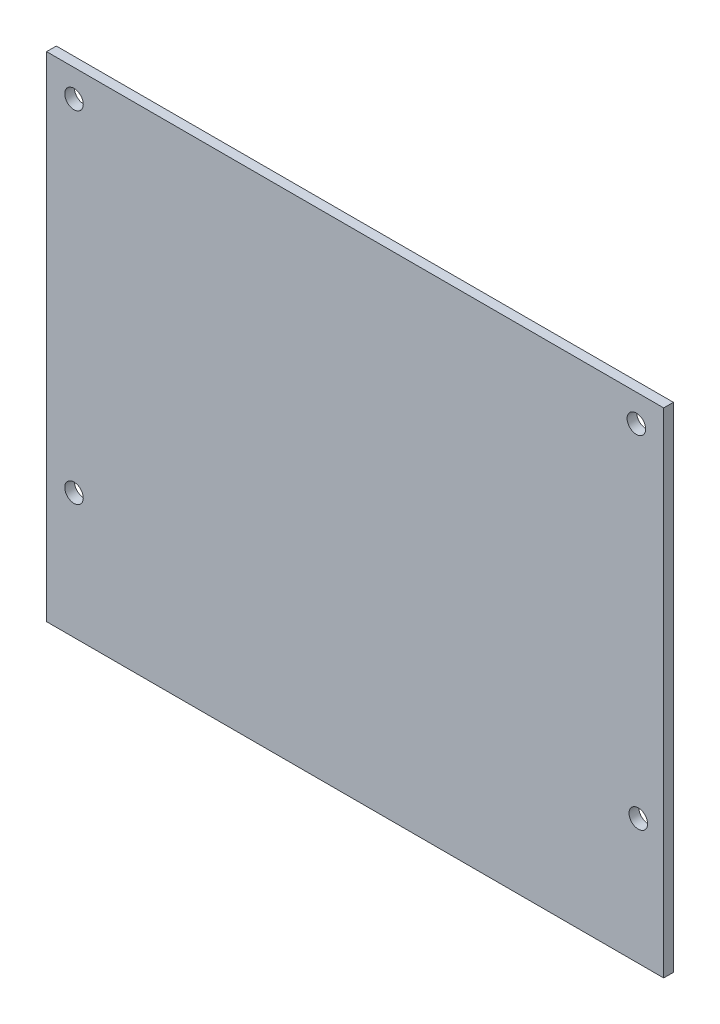
ISO-10303-21;
HEADER;
FILE_DESCRIPTION(('STEP AP214'),'2;1');
FILE_NAME('part.step','',(''),(''),'','','');
FILE_SCHEMA(('AUTOMOTIVE_DESIGN { 1 0 10303 214 1 1 1 1 }'));
ENDSEC;
DATA;
#1=APPLICATION_CONTEXT('core data for automotive mechanical design processes');
#2=APPLICATION_PROTOCOL_DEFINITION('international standard','automotive_design',2000,#1);
#3=PRODUCT_CONTEXT('',#1,'mechanical');
#4=PRODUCT('Part','Part','',(#3));
#5=PRODUCT_RELATED_PRODUCT_CATEGORY('part','',(#4));
#6=PRODUCT_DEFINITION_FORMATION('','',#4);
#7=PRODUCT_DEFINITION_CONTEXT('part definition',#1,'design');
#8=PRODUCT_DEFINITION('design','',#6,#7);
#9=PRODUCT_DEFINITION_SHAPE('','',#8);
#10=(LENGTH_UNIT() NAMED_UNIT(*) SI_UNIT(.MILLI.,.METRE.));
#11=(NAMED_UNIT(*) PLANE_ANGLE_UNIT() SI_UNIT($,.RADIAN.));
#12=(NAMED_UNIT(*) SI_UNIT($,.STERADIAN.) SOLID_ANGLE_UNIT());
#13=UNCERTAINTY_MEASURE_WITH_UNIT(LENGTH_MEASURE(1.E-05),#10,'distance_accuracy_value','');
#14=(GEOMETRIC_REPRESENTATION_CONTEXT(3) GLOBAL_UNCERTAINTY_ASSIGNED_CONTEXT((#13)) GLOBAL_UNIT_ASSIGNED_CONTEXT((#10,
#11,#12)) REPRESENTATION_CONTEXT('',''));
#15=CARTESIAN_POINT('',(0.,0.,0.));
#16=DIRECTION('',(0.,0.,1.));
#17=DIRECTION('',(1.,0.,0.));
#18=AXIS2_PLACEMENT_3D('',#15,#16,#17);
#19=CARTESIAN_POINT('',(0.,0.,-1.5748));
#20=DIRECTION('',(1.,0.,0.));
#21=DIRECTION('',(0.,0.,-1.));
#22=AXIS2_PLACEMENT_3D('',#19,#20,#21);
#23=PLANE('',#22);
#24=DIRECTION('',(0.,1.,0.));
#25=VECTOR('',#24,1.);
#26=CARTESIAN_POINT('',(0.,0.,0.));
#27=LINE('',#26,#25);
#28=CARTESIAN_POINT('',(0.,0.,0.));
#29=VERTEX_POINT('',#28);
#30=CARTESIAN_POINT('',(0.,79.9999924,0.));
#31=VERTEX_POINT('',#30);
#32=EDGE_CURVE('E96',#29,#31,#27,.T.);
#33=ORIENTED_EDGE('',*,*,#32,.T.);
#34=DIRECTION('',(0.,0.,1.));
#35=VECTOR('',#34,1.);
#36=CARTESIAN_POINT('',(0.,79.9999924,-1.5748));
#37=LINE('',#36,#35);
#38=CARTESIAN_POINT('',(0.,79.9999924,-1.5748));
#39=VERTEX_POINT('',#38);
#40=EDGE_CURVE('E11',#39,#31,#37,.T.);
#41=ORIENTED_EDGE('',*,*,#40,.F.);
#42=DIRECTION('',(0.,1.,0.));
#43=VECTOR('',#42,1.);
#44=CARTESIAN_POINT('',(0.,0.,-1.5748));
#45=LINE('',#44,#43);
#46=CARTESIAN_POINT('',(0.,0.,-1.5748));
#47=VERTEX_POINT('',#46);
#48=EDGE_CURVE('E82',#47,#39,#45,.T.);
#49=ORIENTED_EDGE('',*,*,#48,.F.);
#50=DIRECTION('',(0.,0.,1.));
#51=VECTOR('',#50,1.);
#52=CARTESIAN_POINT('',(0.,0.,-1.5748));
#53=LINE('',#52,#51);
#54=EDGE_CURVE('E49',#47,#29,#53,.T.);
#55=ORIENTED_EDGE('',*,*,#54,.T.);
#56=EDGE_LOOP('',(#33,#41,#49,#55));
#57=FACE_BOUND('',#56,.T.);
#58=ADVANCED_FACE('F33',(#57),#23,.F.);
#59=CARTESIAN_POINT('',(0.,79.9999924,-1.5748));
#60=DIRECTION('',(0.,-1.,0.));
#61=DIRECTION('',(0.,0.,-1.));
#62=AXIS2_PLACEMENT_3D('',#59,#60,#61);
#63=PLANE('',#62);
#64=DIRECTION('',(1.,0.,0.));
#65=VECTOR('',#64,1.);
#66=CARTESIAN_POINT('',(0.,79.9999924,0.));
#67=LINE('',#66,#65);
#68=CARTESIAN_POINT('',(100.0000032,79.9999924,0.));
#69=VERTEX_POINT('',#68);
#70=EDGE_CURVE('E87',#31,#69,#67,.T.);
#71=ORIENTED_EDGE('',*,*,#70,.T.);
#72=DIRECTION('',(0.,0.,1.));
#73=VECTOR('',#72,1.);
#74=CARTESIAN_POINT('',(100.0000032,79.9999924,-1.5748));
#75=LINE('',#74,#73);
#76=CARTESIAN_POINT('',(100.0000032,79.9999924,-1.5748));
#77=VERTEX_POINT('',#76);
#78=EDGE_CURVE('E41',#77,#69,#75,.T.);
#79=ORIENTED_EDGE('',*,*,#78,.F.);
#80=DIRECTION('',(1.,0.,0.));
#81=VECTOR('',#80,1.);
#82=CARTESIAN_POINT('',(0.,79.9999924,-1.5748));
#83=LINE('',#82,#81);
#84=EDGE_CURVE('E75',#39,#77,#83,.T.);
#85=ORIENTED_EDGE('',*,*,#84,.F.);
#86=ORIENTED_EDGE('',*,*,#40,.T.);
#87=EDGE_LOOP('',(#71,#79,#85,#86));
#88=FACE_BOUND('',#87,.T.);
#89=ADVANCED_FACE('F86',(#88),#63,.F.);
#90=CARTESIAN_POINT('',(100.0000032,79.9999924,-1.5748));
#91=DIRECTION('',(-1.,0.,0.));
#92=DIRECTION('',(0.,0.,1.));
#93=AXIS2_PLACEMENT_3D('',#90,#91,#92);
#94=PLANE('',#93);
#95=DIRECTION('',(0.,-1.,0.));
#96=VECTOR('',#95,1.);
#97=CARTESIAN_POINT('',(100.0000032,79.9999924,0.));
#98=LINE('',#97,#96);
#99=CARTESIAN_POINT('',(100.0000032,0.,0.));
#100=VERTEX_POINT('',#99);
#101=EDGE_CURVE('E100',#69,#100,#98,.T.);
#102=ORIENTED_EDGE('',*,*,#101,.T.);
#103=DIRECTION('',(0.,0.,1.));
#104=VECTOR('',#103,1.);
#105=CARTESIAN_POINT('',(100.0000032,0.,-1.5748));
#106=LINE('',#105,#104);
#107=CARTESIAN_POINT('',(100.0000032,0.,-1.5748));
#108=VERTEX_POINT('',#107);
#109=EDGE_CURVE('E64',#108,#100,#106,.T.);
#110=ORIENTED_EDGE('',*,*,#109,.F.);
#111=DIRECTION('',(0.,-1.,0.));
#112=VECTOR('',#111,1.);
#113=CARTESIAN_POINT('',(100.0000032,79.9999924,-1.5748));
#114=LINE('',#113,#112);
#115=EDGE_CURVE('E81',#77,#108,#114,.T.);
#116=ORIENTED_EDGE('',*,*,#115,.F.);
#117=ORIENTED_EDGE('',*,*,#78,.T.);
#118=EDGE_LOOP('',(#102,#110,#116,#117));
#119=FACE_BOUND('',#118,.T.);
#120=ADVANCED_FACE('F90',(#119),#94,.F.);
#121=CARTESIAN_POINT('',(0.,0.,-1.5748));
#122=DIRECTION('',(0.,-1.,0.));
#123=DIRECTION('',(0.,0.,-1.));
#124=AXIS2_PLACEMENT_3D('',#121,#122,#123);
#125=PLANE('',#124);
#126=DIRECTION('',(1.,0.,0.));
#127=VECTOR('',#126,1.);
#128=CARTESIAN_POINT('',(0.,0.,0.));
#129=LINE('',#128,#127);
#130=EDGE_CURVE('E102',#29,#100,#129,.T.);
#131=ORIENTED_EDGE('',*,*,#130,.F.);
#132=ORIENTED_EDGE('',*,*,#54,.F.);
#133=DIRECTION('',(1.,0.,0.));
#134=VECTOR('',#133,1.);
#135=CARTESIAN_POINT('',(0.,0.,-1.5748));
#136=LINE('',#135,#134);
#137=EDGE_CURVE('E91',#47,#108,#136,.T.);
#138=ORIENTED_EDGE('',*,*,#137,.T.);
#139=ORIENTED_EDGE('',*,*,#109,.T.);
#140=EDGE_LOOP('',(#131,#132,#138,#139));
#141=FACE_BOUND('',#140,.T.);
#142=ADVANCED_FACE('F151',(#141),#125,.T.);
#143=CARTESIAN_POINT('',(0.,79.9999924,-1.5748));
#144=DIRECTION('',(0.,0.,-1.));
#145=DIRECTION('',(-1.,0.,0.));
#146=AXIS2_PLACEMENT_3D('',#143,#144,#145);
#147=PLANE('',#146);
#148=CARTESIAN_POINT('',(4.445,20.32,-1.5748));
#149=DIRECTION('',(0.,0.,1.));
#150=DIRECTION('',(1.,0.,0.));
#151=AXIS2_PLACEMENT_3D('',#148,#149,#150);
#152=CIRCLE('',#151,1.499997);
#153=CARTESIAN_POINT('',(5.944997,20.32,-1.5748));
#154=VERTEX_POINT('',#153);
#155=EDGE_CURVE('E123',#154,#154,#152,.T.);
#156=ORIENTED_EDGE('',*,*,#155,.T.);
#157=EDGE_LOOP('',(#156));
#158=FACE_BOUND('',#157,.T.);
#159=CARTESIAN_POINT('',(4.445,75.565,-1.5748));
#160=DIRECTION('',(0.,0.,1.));
#161=DIRECTION('',(1.,0.,0.));
#162=AXIS2_PLACEMENT_3D('',#159,#160,#161);
#163=CIRCLE('',#162,1.499997);
#164=CARTESIAN_POINT('',(5.944997,75.565,-1.5748));
#165=VERTEX_POINT('',#164);
#166=EDGE_CURVE('E117',#165,#165,#163,.T.);
#167=ORIENTED_EDGE('',*,*,#166,.T.);
#168=EDGE_LOOP('',(#167));
#169=FACE_BOUND('',#168,.T.);
#170=CARTESIAN_POINT('',(95.5675,75.565,-1.5748));
#171=DIRECTION('',(0.,0.,1.));
#172=DIRECTION('',(1.,0.,0.));
#173=AXIS2_PLACEMENT_3D('',#170,#171,#172);
#174=CIRCLE('',#173,1.49999699999999);
#175=CARTESIAN_POINT('',(97.067497,75.565,-1.5748));
#176=VERTEX_POINT('',#175);
#177=EDGE_CURVE('E111',#176,#176,#174,.T.);
#178=ORIENTED_EDGE('',*,*,#177,.T.);
#179=EDGE_LOOP('',(#178));
#180=FACE_BOUND('',#179,.T.);
#181=CARTESIAN_POINT('',(95.885,20.32,-1.5748));
#182=DIRECTION('',(0.,0.,1.));
#183=DIRECTION('',(1.,0.,0.));
#184=AXIS2_PLACEMENT_3D('',#181,#182,#183);
#185=CIRCLE('',#184,1.49999700000001);
#186=CARTESIAN_POINT('',(97.384997,20.32,-1.5748));
#187=VERTEX_POINT('',#186);
#188=EDGE_CURVE('E98',#187,#187,#185,.T.);
#189=ORIENTED_EDGE('',*,*,#188,.T.);
#190=EDGE_LOOP('',(#189));
#191=FACE_BOUND('',#190,.T.);
#192=ORIENTED_EDGE('',*,*,#48,.T.);
#193=ORIENTED_EDGE('',*,*,#84,.T.);
#194=ORIENTED_EDGE('',*,*,#115,.T.);
#195=ORIENTED_EDGE('',*,*,#137,.F.);
#196=EDGE_LOOP('',(#192,#193,#194,#195));
#197=FACE_BOUND('',#196,.T.);
#198=ADVANCED_FACE('F78',(#158,#169,#180,#191,#197),#147,.T.);
#199=CARTESIAN_POINT('',(0.,79.9999924,0.));
#200=DIRECTION('',(0.,0.,-1.));
#201=DIRECTION('',(-1.,0.,0.));
#202=AXIS2_PLACEMENT_3D('',#199,#200,#201);
#203=PLANE('',#202);
#204=CARTESIAN_POINT('',(4.445,20.32,0.));
#205=DIRECTION('',(0.,0.,1.));
#206=DIRECTION('',(1.,0.,0.));
#207=AXIS2_PLACEMENT_3D('',#204,#205,#206);
#208=CIRCLE('',#207,1.499997);
#209=CARTESIAN_POINT('',(5.944997,20.32,0.));
#210=VERTEX_POINT('',#209);
#211=EDGE_CURVE('E126',#210,#210,#208,.T.);
#212=ORIENTED_EDGE('',*,*,#211,.F.);
#213=EDGE_LOOP('',(#212));
#214=FACE_BOUND('',#213,.T.);
#215=CARTESIAN_POINT('',(4.445,75.565,0.));
#216=DIRECTION('',(0.,0.,1.));
#217=DIRECTION('',(1.,0.,0.));
#218=AXIS2_PLACEMENT_3D('',#215,#216,#217);
#219=CIRCLE('',#218,1.499997);
#220=CARTESIAN_POINT('',(5.944997,75.565,0.));
#221=VERTEX_POINT('',#220);
#222=EDGE_CURVE('E120',#221,#221,#219,.T.);
#223=ORIENTED_EDGE('',*,*,#222,.F.);
#224=EDGE_LOOP('',(#223));
#225=FACE_BOUND('',#224,.T.);
#226=CARTESIAN_POINT('',(95.5675,75.565,0.));
#227=DIRECTION('',(0.,0.,1.));
#228=DIRECTION('',(1.,0.,0.));
#229=AXIS2_PLACEMENT_3D('',#226,#227,#228);
#230=CIRCLE('',#229,1.49999699999999);
#231=CARTESIAN_POINT('',(97.067497,75.565,0.));
#232=VERTEX_POINT('',#231);
#233=EDGE_CURVE('E114',#232,#232,#230,.T.);
#234=ORIENTED_EDGE('',*,*,#233,.F.);
#235=EDGE_LOOP('',(#234));
#236=FACE_BOUND('',#235,.T.);
#237=CARTESIAN_POINT('',(95.885,20.32,0.));
#238=DIRECTION('',(0.,0.,1.));
#239=DIRECTION('',(1.,0.,0.));
#240=AXIS2_PLACEMENT_3D('',#237,#238,#239);
#241=CIRCLE('',#240,1.49999700000001);
#242=CARTESIAN_POINT('',(97.384997,20.32,0.));
#243=VERTEX_POINT('',#242);
#244=EDGE_CURVE('E108',#243,#243,#241,.T.);
#245=ORIENTED_EDGE('',*,*,#244,.F.);
#246=EDGE_LOOP('',(#245));
#247=FACE_BOUND('',#246,.T.);
#248=ORIENTED_EDGE('',*,*,#32,.F.);
#249=ORIENTED_EDGE('',*,*,#130,.T.);
#250=ORIENTED_EDGE('',*,*,#101,.F.);
#251=ORIENTED_EDGE('',*,*,#70,.F.);
#252=EDGE_LOOP('',(#248,#249,#250,#251));
#253=FACE_BOUND('',#252,.T.);
#254=ADVANCED_FACE('F141',(#214,#225,#236,#247,#253),#203,.F.);
#255=CARTESIAN_POINT('',(95.885,20.32,-1.5748));
#256=DIRECTION('',(0.,0.,1.));
#257=DIRECTION('',(1.,0.,0.));
#258=AXIS2_PLACEMENT_3D('',#255,#256,#257);
#259=CYLINDRICAL_SURFACE('',#258,1.49999700000001);
#260=ORIENTED_EDGE('',*,*,#188,.F.);
#261=EDGE_LOOP('',(#260));
#262=FACE_BOUND('',#261,.T.);
#263=ORIENTED_EDGE('',*,*,#244,.T.);
#264=EDGE_LOOP('',(#263));
#265=FACE_BOUND('',#264,.T.);
#266=ADVANCED_FACE('F144',(#262,#265),#259,.F.);
#267=CARTESIAN_POINT('',(95.5675,75.565,-1.5748));
#268=DIRECTION('',(0.,0.,1.));
#269=DIRECTION('',(1.,0.,0.));
#270=AXIS2_PLACEMENT_3D('',#267,#268,#269);
#271=CYLINDRICAL_SURFACE('',#270,1.49999699999999);
#272=ORIENTED_EDGE('',*,*,#177,.F.);
#273=EDGE_LOOP('',(#272));
#274=FACE_BOUND('',#273,.T.);
#275=ORIENTED_EDGE('',*,*,#233,.T.);
#276=EDGE_LOOP('',(#275));
#277=FACE_BOUND('',#276,.T.);
#278=ADVANCED_FACE('F195',(#274,#277),#271,.F.);
#279=CARTESIAN_POINT('',(4.445,75.565,-1.5748));
#280=DIRECTION('',(0.,0.,1.));
#281=DIRECTION('',(1.,0.,0.));
#282=AXIS2_PLACEMENT_3D('',#279,#280,#281);
#283=CYLINDRICAL_SURFACE('',#282,1.499997);
#284=ORIENTED_EDGE('',*,*,#166,.F.);
#285=EDGE_LOOP('',(#284));
#286=FACE_BOUND('',#285,.T.);
#287=ORIENTED_EDGE('',*,*,#222,.T.);
#288=EDGE_LOOP('',(#287));
#289=FACE_BOUND('',#288,.T.);
#290=ADVANCED_FACE('F137',(#286,#289),#283,.F.);
#291=CARTESIAN_POINT('',(4.445,20.32,-1.5748));
#292=DIRECTION('',(0.,0.,1.));
#293=DIRECTION('',(1.,0.,0.));
#294=AXIS2_PLACEMENT_3D('',#291,#292,#293);
#295=CYLINDRICAL_SURFACE('',#294,1.499997);
#296=ORIENTED_EDGE('',*,*,#155,.F.);
#297=EDGE_LOOP('',(#296));
#298=FACE_BOUND('',#297,.T.);
#299=ORIENTED_EDGE('',*,*,#211,.T.);
#300=EDGE_LOOP('',(#299));
#301=FACE_BOUND('',#300,.T.);
#302=ADVANCED_FACE('F134',(#298,#301),#295,.F.);
#303=CLOSED_SHELL('',(#58,#89,#120,#142,#198,#254,#266,#278,#290,#302));
#304=MANIFOLD_SOLID_BREP('B2',#303);
#305=ADVANCED_BREP_SHAPE_REPRESENTATION('',(#18,#304),#14);
#306=SHAPE_DEFINITION_REPRESENTATION(#9,#305);
ENDSEC;
END-ISO-10303-21;
